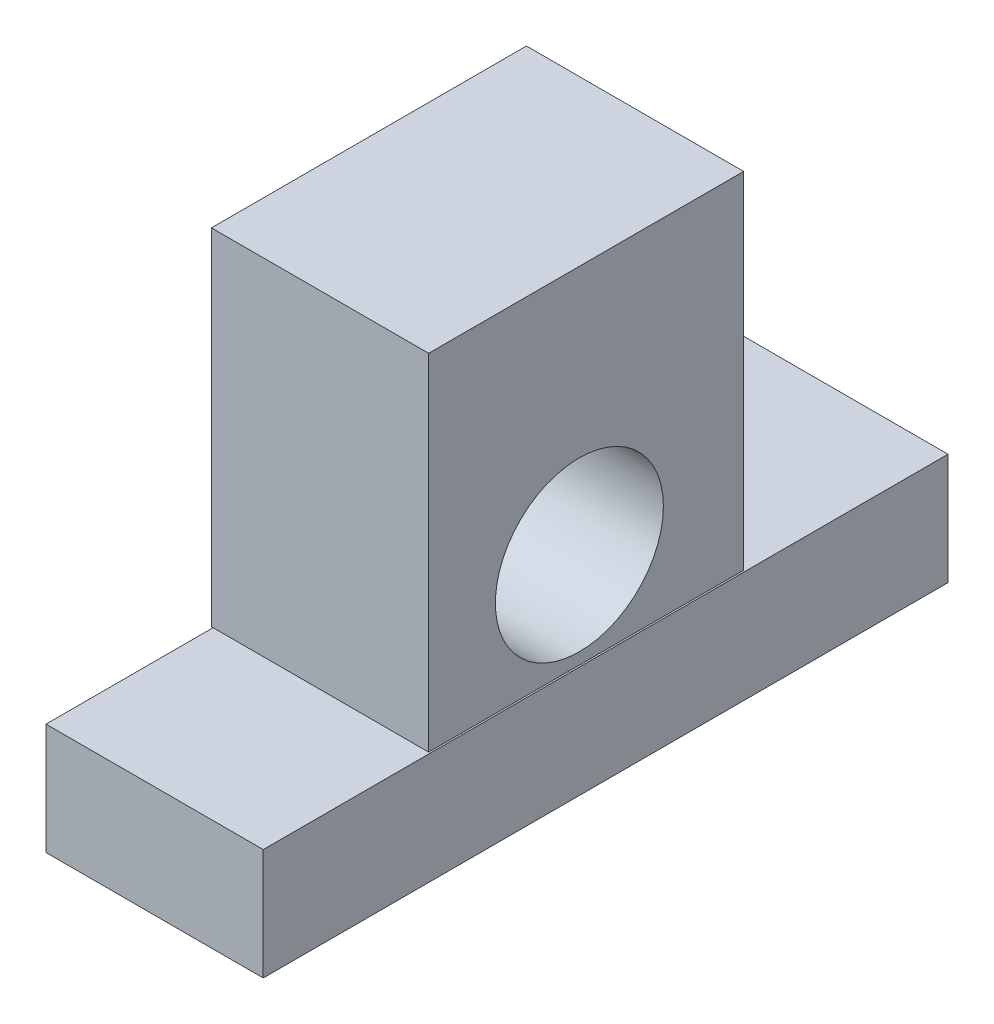
ISO-10303-21;
HEADER;
FILE_DESCRIPTION(('STEP AP214'),'2;1');
FILE_NAME('part.step','',(''),(''),'','','');
FILE_SCHEMA(('AUTOMOTIVE_DESIGN { 1 0 10303 214 1 1 1 1 }'));
ENDSEC;
DATA;
#1=APPLICATION_CONTEXT('core data for automotive mechanical design processes');
#2=APPLICATION_PROTOCOL_DEFINITION('international standard','automotive_design',2000,#1);
#3=PRODUCT_CONTEXT('',#1,'mechanical');
#4=PRODUCT('Part','Part','',(#3));
#5=PRODUCT_RELATED_PRODUCT_CATEGORY('part','',(#4));
#6=PRODUCT_DEFINITION_FORMATION('','',#4);
#7=PRODUCT_DEFINITION_CONTEXT('part definition',#1,'design');
#8=PRODUCT_DEFINITION('design','',#6,#7);
#9=PRODUCT_DEFINITION_SHAPE('','',#8);
#10=(LENGTH_UNIT() NAMED_UNIT(*) SI_UNIT(.MILLI.,.METRE.));
#11=(NAMED_UNIT(*) PLANE_ANGLE_UNIT() SI_UNIT($,.RADIAN.));
#12=(NAMED_UNIT(*) SI_UNIT($,.STERADIAN.) SOLID_ANGLE_UNIT());
#13=UNCERTAINTY_MEASURE_WITH_UNIT(LENGTH_MEASURE(1.E-05),#10,'distance_accuracy_value','');
#14=(GEOMETRIC_REPRESENTATION_CONTEXT(3) GLOBAL_UNCERTAINTY_ASSIGNED_CONTEXT((#13)) GLOBAL_UNIT_ASSIGNED_CONTEXT((#10,
#11,#12)) REPRESENTATION_CONTEXT('',''));
#15=CARTESIAN_POINT('',(0.,0.,0.));
#16=DIRECTION('',(0.,0.,1.));
#17=DIRECTION('',(1.,0.,0.));
#18=AXIS2_PLACEMENT_3D('',#15,#16,#17);
#19=CARTESIAN_POINT('',(31.75,-13.97,22.0275119617225));
#20=DIRECTION('',(0.,1.,0.));
#21=DIRECTION('',(0.,0.,1.));
#22=AXIS2_PLACEMENT_3D('',#19,#20,#21);
#23=PLANE('',#22);
#24=DIRECTION('',(0.,0.,-1.));
#25=VECTOR('',#24,1.);
#26=CARTESIAN_POINT('',(0.242688265662183,-13.97,-53.6300320258065));
#27=LINE('',#26,#25);
#28=CARTESIAN_POINT('',(0.242688265662178,-13.97,22.0275119617225));
#29=VERTEX_POINT('',#28);
#30=CARTESIAN_POINT('',(0.24268826566218,-13.97,-24.0099880382775));
#31=VERTEX_POINT('',#30);
#32=EDGE_CURVE('E11',#29,#31,#27,.T.);
#33=ORIENTED_EDGE('',*,*,#32,.F.);
#34=DIRECTION('',(-1.,0.,0.));
#35=VECTOR('',#34,1.);
#36=CARTESIAN_POINT('',(31.75,-13.97,22.0275119617225));
#37=LINE('',#36,#35);
#38=CARTESIAN_POINT('',(0.,-13.97,22.0275119617225));
#39=VERTEX_POINT('',#38);
#40=EDGE_CURVE('E170',#29,#39,#37,.T.);
#41=ORIENTED_EDGE('',*,*,#40,.T.);
#42=DIRECTION('',(0.,0.,-1.));
#43=VECTOR('',#42,1.);
#44=CARTESIAN_POINT('',(0.,-13.97,22.0275119617225));
#45=LINE('',#44,#43);
#46=CARTESIAN_POINT('',(0.,-13.97,-24.0099880382775));
#47=VERTEX_POINT('',#46);
#48=EDGE_CURVE('E160',#39,#47,#45,.T.);
#49=ORIENTED_EDGE('',*,*,#48,.T.);
#50=DIRECTION('',(-1.,0.,0.));
#51=VECTOR('',#50,1.);
#52=CARTESIAN_POINT('',(31.75,-13.97,-24.0099880382775));
#53=LINE('',#52,#51);
#54=EDGE_CURVE('E168',#31,#47,#53,.T.);
#55=ORIENTED_EDGE('',*,*,#54,.F.);
#56=EDGE_LOOP('',(#33,#41,#49,#55));
#57=FACE_BOUND('',#56,.T.);
#58=ADVANCED_FACE('F33',(#57),#23,.F.);
#59=CARTESIAN_POINT('',(31.75,0.,0.));
#60=DIRECTION('',(1.,0.,0.));
#61=DIRECTION('',(0.,0.,-1.));
#62=AXIS2_PLACEMENT_3D('',#59,#60,#61);
#63=PLANE('',#62);
#64=DIRECTION('',(0.,-1.,0.));
#65=VECTOR('',#64,1.);
#66=CARTESIAN_POINT('',(31.75,36.5125,22.0275119617225));
#67=LINE('',#66,#65);
#68=CARTESIAN_POINT('',(31.75,36.5125,22.0275119617225));
#69=VERTEX_POINT('',#68);
#70=CARTESIAN_POINT('',(31.75,-13.97,22.0275119617225));
#71=VERTEX_POINT('',#70);
#72=EDGE_CURVE('E83',#69,#71,#67,.T.);
#73=ORIENTED_EDGE('',*,*,#72,.T.);
#74=DIRECTION('',(0.,0.,-1.));
#75=VECTOR('',#74,1.);
#76=CARTESIAN_POINT('',(31.75,-13.97,22.0275119617225));
#77=LINE('',#76,#75);
#78=CARTESIAN_POINT('',(31.75,-13.97,-24.0099880382775));
#79=VERTEX_POINT('',#78);
#80=EDGE_CURVE('E152',#71,#79,#77,.T.);
#81=ORIENTED_EDGE('',*,*,#80,.T.);
#82=DIRECTION('',(0.,1.,0.));
#83=VECTOR('',#82,1.);
#84=CARTESIAN_POINT('',(31.75,36.5125,-24.0099880382775));
#85=LINE('',#84,#83);
#86=CARTESIAN_POINT('',(31.75,36.5125,-24.0099880382775));
#87=VERTEX_POINT('',#86);
#88=EDGE_CURVE('E154',#79,#87,#85,.T.);
#89=ORIENTED_EDGE('',*,*,#88,.T.);
#90=DIRECTION('',(0.,0.,1.));
#91=VECTOR('',#90,1.);
#92=CARTESIAN_POINT('',(31.75,36.5125,22.0275119617225));
#93=LINE('',#92,#91);
#94=EDGE_CURVE('E58',#87,#69,#93,.T.);
#95=ORIENTED_EDGE('',*,*,#94,.T.);
#96=EDGE_LOOP('',(#73,#81,#89,#95));
#97=FACE_BOUND('',#96,.T.);
#98=CARTESIAN_POINT('',(31.75,0.,0.));
#99=DIRECTION('',(1.,0.,0.));
#100=DIRECTION('',(0.,0.,-1.));
#101=AXIS2_PLACEMENT_3D('',#98,#99,#100);
#102=CIRCLE('',#101,12.2772807915406);
#103=CARTESIAN_POINT('',(31.75,0.,-12.2772807915406));
#104=VERTEX_POINT('',#103);
#105=EDGE_CURVE('E142',#104,#104,#102,.T.);
#106=ORIENTED_EDGE('',*,*,#105,.F.);
#107=EDGE_LOOP('',(#106));
#108=FACE_BOUND('',#107,.T.);
#109=ADVANCED_FACE('F215',(#97,#108),#63,.T.);
#110=CARTESIAN_POINT('',(0.,0.,0.));
#111=DIRECTION('',(1.,0.,0.));
#112=DIRECTION('',(0.,0.,-1.));
#113=AXIS2_PLACEMENT_3D('',#110,#111,#112);
#114=PLANE('',#113);
#115=DIRECTION('',(0.,-1.,0.));
#116=VECTOR('',#115,1.);
#117=CARTESIAN_POINT('',(0.,36.5125,22.0275119617225));
#118=LINE('',#117,#116);
#119=CARTESIAN_POINT('',(0.,36.5125,22.0275119617225));
#120=VERTEX_POINT('',#119);
#121=EDGE_CURVE('E149',#120,#39,#118,.T.);
#122=ORIENTED_EDGE('',*,*,#121,.F.);
#123=DIRECTION('',(0.,0.,1.));
#124=VECTOR('',#123,1.);
#125=CARTESIAN_POINT('',(0.,36.5125,22.0275119617225));
#126=LINE('',#125,#124);
#127=CARTESIAN_POINT('',(0.,36.5125,-24.0099880382775));
#128=VERTEX_POINT('',#127);
#129=EDGE_CURVE('E78',#128,#120,#126,.T.);
#130=ORIENTED_EDGE('',*,*,#129,.F.);
#131=DIRECTION('',(0.,1.,0.));
#132=VECTOR('',#131,1.);
#133=CARTESIAN_POINT('',(0.,36.5125,-24.0099880382775));
#134=LINE('',#133,#132);
#135=EDGE_CURVE('E163',#47,#128,#134,.T.);
#136=ORIENTED_EDGE('',*,*,#135,.F.);
#137=ORIENTED_EDGE('',*,*,#48,.F.);
#138=EDGE_LOOP('',(#122,#130,#136,#137));
#139=FACE_BOUND('',#138,.T.);
#140=CARTESIAN_POINT('',(0.,0.,0.));
#141=DIRECTION('',(1.,0.,0.));
#142=DIRECTION('',(0.,0.,-1.));
#143=AXIS2_PLACEMENT_3D('',#140,#141,#142);
#144=CIRCLE('',#143,12.2772807915406);
#145=CARTESIAN_POINT('',(0.,0.,-12.2772807915406));
#146=VERTEX_POINT('',#145);
#147=EDGE_CURVE('E139',#146,#146,#144,.T.);
#148=ORIENTED_EDGE('',*,*,#147,.T.);
#149=EDGE_LOOP('',(#148));
#150=FACE_BOUND('',#149,.T.);
#151=ADVANCED_FACE('F180',(#139,#150),#114,.F.);
#152=CARTESIAN_POINT('',(31.75,36.5125,22.0275119617225));
#153=DIRECTION('',(0.,0.,-1.));
#154=DIRECTION('',(0.,1.,0.));
#155=AXIS2_PLACEMENT_3D('',#152,#153,#154);
#156=PLANE('',#155);
#157=ORIENTED_EDGE('',*,*,#121,.T.);
#158=ORIENTED_EDGE('',*,*,#40,.F.);
#159=EDGE_CURVE('E37',#71,#29,#37,.T.);
#160=ORIENTED_EDGE('',*,*,#159,.F.);
#161=ORIENTED_EDGE('',*,*,#72,.F.);
#162=DIRECTION('',(-1.,0.,0.));
#163=VECTOR('',#162,1.);
#164=CARTESIAN_POINT('',(31.75,36.5125,22.0275119617225));
#165=LINE('',#164,#163);
#166=EDGE_CURVE('E157',#69,#120,#165,.T.);
#167=ORIENTED_EDGE('',*,*,#166,.T.);
#168=EDGE_LOOP('',(#157,#158,#160,#161,#167));
#169=FACE_BOUND('',#168,.T.);
#170=ADVANCED_FACE('F35',(#169),#156,.F.);
#171=CARTESIAN_POINT('',(31.75,36.5125,-24.0099880382775));
#172=DIRECTION('',(0.,0.,1.));
#173=DIRECTION('',(0.,-1.,0.));
#174=AXIS2_PLACEMENT_3D('',#171,#172,#173);
#175=PLANE('',#174);
#176=ORIENTED_EDGE('',*,*,#135,.T.);
#177=DIRECTION('',(-1.,0.,0.));
#178=VECTOR('',#177,1.);
#179=CARTESIAN_POINT('',(31.75,36.5125,-24.0099880382775));
#180=LINE('',#179,#178);
#181=EDGE_CURVE('E167',#87,#128,#180,.T.);
#182=ORIENTED_EDGE('',*,*,#181,.F.);
#183=ORIENTED_EDGE('',*,*,#88,.F.);
#184=EDGE_CURVE('E169',#79,#31,#53,.T.);
#185=ORIENTED_EDGE('',*,*,#184,.T.);
#186=ORIENTED_EDGE('',*,*,#54,.T.);
#187=EDGE_LOOP('',(#176,#182,#183,#185,#186));
#188=FACE_BOUND('',#187,.T.);
#189=ADVANCED_FACE('F174',(#188),#175,.F.);
#190=CARTESIAN_POINT('',(31.75,36.5125,22.0275119617225));
#191=DIRECTION('',(0.,-1.,0.));
#192=DIRECTION('',(0.,0.,-1.));
#193=AXIS2_PLACEMENT_3D('',#190,#191,#192);
#194=PLANE('',#193);
#195=ORIENTED_EDGE('',*,*,#129,.T.);
#196=ORIENTED_EDGE('',*,*,#166,.F.);
#197=ORIENTED_EDGE('',*,*,#94,.F.);
#198=ORIENTED_EDGE('',*,*,#181,.T.);
#199=EDGE_LOOP('',(#195,#196,#197,#198));
#200=FACE_BOUND('',#199,.T.);
#201=ADVANCED_FACE('F184',(#200),#194,.F.);
#202=CARTESIAN_POINT('',(31.75,0.,0.));
#203=DIRECTION('',(-1.,0.,0.));
#204=DIRECTION('',(0.,0.,1.));
#205=AXIS2_PLACEMENT_3D('',#202,#203,#204);
#206=CYLINDRICAL_SURFACE('',#205,12.2772807915406);
#207=ORIENTED_EDGE('',*,*,#105,.T.);
#208=EDGE_LOOP('',(#207));
#209=FACE_BOUND('',#208,.T.);
#210=ORIENTED_EDGE('',*,*,#147,.F.);
#211=EDGE_LOOP('',(#210));
#212=FACE_BOUND('',#211,.T.);
#213=ADVANCED_FACE('F225',(#209,#212),#206,.F.);
#214=CARTESIAN_POINT('',(0.,-13.97,0.));
#215=DIRECTION('',(0.,1.,0.));
#216=DIRECTION('',(0.,0.,1.));
#217=AXIS2_PLACEMENT_3D('',#214,#215,#216);
#218=PLANE('',#217);
#219=ORIENTED_EDGE('',*,*,#184,.F.);
#220=ORIENTED_EDGE('',*,*,#80,.F.);
#221=ORIENTED_EDGE('',*,*,#159,.T.);
#222=CARTESIAN_POINT('',(0.242688265662171,-13.97,46.4459679741935));
#223=VERTEX_POINT('',#222);
#224=EDGE_CURVE('E43',#223,#29,#27,.T.);
#225=ORIENTED_EDGE('',*,*,#224,.F.);
#226=DIRECTION('',(-1.,0.,0.));
#227=VECTOR('',#226,1.);
#228=CARTESIAN_POINT('',(0.242688265662171,-13.97,46.4459679741935));
#229=LINE('',#228,#227);
#230=CARTESIAN_POINT('',(31.9926882656622,-13.97,46.4459679741935));
#231=VERTEX_POINT('',#230);
#232=EDGE_CURVE('E133',#231,#223,#229,.T.);
#233=ORIENTED_EDGE('',*,*,#232,.F.);
#234=DIRECTION('',(0.,0.,1.));
#235=VECTOR('',#234,1.);
#236=CARTESIAN_POINT('',(31.9926882656622,-13.97,-53.6300320258065));
#237=LINE('',#236,#235);
#238=CARTESIAN_POINT('',(31.9926882656622,-13.97,-53.6300320258065));
#239=VERTEX_POINT('',#238);
#240=EDGE_CURVE('E193',#239,#231,#237,.T.);
#241=ORIENTED_EDGE('',*,*,#240,.F.);
#242=DIRECTION('',(1.,0.,0.));
#243=VECTOR('',#242,1.);
#244=CARTESIAN_POINT('',(0.242688265662183,-13.97,-53.6300320258065));
#245=LINE('',#244,#243);
#246=CARTESIAN_POINT('',(0.242688265662183,-13.97,-53.6300320258065));
#247=VERTEX_POINT('',#246);
#248=EDGE_CURVE('E189',#247,#239,#245,.T.);
#249=ORIENTED_EDGE('',*,*,#248,.F.);
#250=EDGE_CURVE('E44',#31,#247,#27,.T.);
#251=ORIENTED_EDGE('',*,*,#250,.F.);
#252=EDGE_LOOP('',(#219,#220,#221,#225,#233,#241,#249,#251));
#253=FACE_BOUND('',#252,.T.);
#254=ADVANCED_FACE('F187',(#253),#218,.T.);
#255=CARTESIAN_POINT('',(0.242688265662183,-30.226,-53.6300320258065));
#256=DIRECTION('',(1.,0.,0.));
#257=DIRECTION('',(0.,0.,-1.));
#258=AXIS2_PLACEMENT_3D('',#255,#256,#257);
#259=PLANE('',#258);
#260=ORIENTED_EDGE('',*,*,#224,.T.);
#261=ORIENTED_EDGE('',*,*,#32,.T.);
#262=ORIENTED_EDGE('',*,*,#250,.T.);
#263=DIRECTION('',(0.,1.,0.));
#264=VECTOR('',#263,1.);
#265=CARTESIAN_POINT('',(0.242688265662183,-30.226,-53.6300320258065));
#266=LINE('',#265,#264);
#267=CARTESIAN_POINT('',(0.242688265662183,-30.226,-53.6300320258065));
#268=VERTEX_POINT('',#267);
#269=EDGE_CURVE('E118',#268,#247,#266,.T.);
#270=ORIENTED_EDGE('',*,*,#269,.F.);
#271=DIRECTION('',(0.,0.,-1.));
#272=VECTOR('',#271,1.);
#273=CARTESIAN_POINT('',(0.242688265662183,-30.226,-53.6300320258065));
#274=LINE('',#273,#272);
#275=CARTESIAN_POINT('',(0.242688265662171,-30.226,46.4459679741935));
#276=VERTEX_POINT('',#275);
#277=EDGE_CURVE('E124',#276,#268,#274,.T.);
#278=ORIENTED_EDGE('',*,*,#277,.F.);
#279=DIRECTION('',(0.,1.,0.));
#280=VECTOR('',#279,1.);
#281=CARTESIAN_POINT('',(0.242688265662171,-30.226,46.4459679741935));
#282=LINE('',#281,#280);
#283=EDGE_CURVE('E191',#276,#223,#282,.T.);
#284=ORIENTED_EDGE('',*,*,#283,.T.);
#285=EDGE_LOOP('',(#260,#261,#262,#270,#278,#284));
#286=FACE_BOUND('',#285,.T.);
#287=ADVANCED_FACE('F136',(#286),#259,.F.);
#288=CARTESIAN_POINT('',(0.242688265662183,-30.226,-53.6300320258065));
#289=DIRECTION('',(0.,0.,1.));
#290=DIRECTION('',(1.,0.,0.));
#291=AXIS2_PLACEMENT_3D('',#288,#289,#290);
#292=PLANE('',#291);
#293=ORIENTED_EDGE('',*,*,#248,.T.);
#294=DIRECTION('',(0.,1.,0.));
#295=VECTOR('',#294,1.);
#296=CARTESIAN_POINT('',(31.9926882656622,-30.226,-53.6300320258065));
#297=LINE('',#296,#295);
#298=CARTESIAN_POINT('',(31.9926882656622,-30.226,-53.6300320258065));
#299=VERTEX_POINT('',#298);
#300=EDGE_CURVE('E120',#299,#239,#297,.T.);
#301=ORIENTED_EDGE('',*,*,#300,.F.);
#302=DIRECTION('',(1.,0.,0.));
#303=VECTOR('',#302,1.);
#304=CARTESIAN_POINT('',(0.242688265662183,-30.226,-53.6300320258065));
#305=LINE('',#304,#303);
#306=EDGE_CURVE('E114',#268,#299,#305,.T.);
#307=ORIENTED_EDGE('',*,*,#306,.F.);
#308=ORIENTED_EDGE('',*,*,#269,.T.);
#309=EDGE_LOOP('',(#293,#301,#307,#308));
#310=FACE_BOUND('',#309,.T.);
#311=ADVANCED_FACE('F116',(#310),#292,.F.);
#312=CARTESIAN_POINT('',(31.9926882656622,-30.226,-53.6300320258065));
#313=DIRECTION('',(-1.,0.,0.));
#314=DIRECTION('',(0.,0.,1.));
#315=AXIS2_PLACEMENT_3D('',#312,#313,#314);
#316=PLANE('',#315);
#317=ORIENTED_EDGE('',*,*,#240,.T.);
#318=DIRECTION('',(0.,1.,0.));
#319=VECTOR('',#318,1.);
#320=CARTESIAN_POINT('',(31.9926882656622,-30.226,46.4459679741935));
#321=LINE('',#320,#319);
#322=CARTESIAN_POINT('',(31.9926882656622,-30.226,46.4459679741935));
#323=VERTEX_POINT('',#322);
#324=EDGE_CURVE('E144',#323,#231,#321,.T.);
#325=ORIENTED_EDGE('',*,*,#324,.F.);
#326=DIRECTION('',(0.,0.,1.));
#327=VECTOR('',#326,1.);
#328=CARTESIAN_POINT('',(31.9926882656622,-30.226,-53.6300320258065));
#329=LINE('',#328,#327);
#330=EDGE_CURVE('E123',#299,#323,#329,.T.);
#331=ORIENTED_EDGE('',*,*,#330,.F.);
#332=ORIENTED_EDGE('',*,*,#300,.T.);
#333=EDGE_LOOP('',(#317,#325,#331,#332));
#334=FACE_BOUND('',#333,.T.);
#335=ADVANCED_FACE('F205',(#334),#316,.F.);
#336=CARTESIAN_POINT('',(0.242688265662171,-30.226,46.4459679741935));
#337=DIRECTION('',(0.,0.,-1.));
#338=DIRECTION('',(-1.,0.,0.));
#339=AXIS2_PLACEMENT_3D('',#336,#337,#338);
#340=PLANE('',#339);
#341=ORIENTED_EDGE('',*,*,#232,.T.);
#342=ORIENTED_EDGE('',*,*,#283,.F.);
#343=DIRECTION('',(-1.,0.,0.));
#344=VECTOR('',#343,1.);
#345=CARTESIAN_POINT('',(0.242688265662171,-30.226,46.4459679741935));
#346=LINE('',#345,#344);
#347=EDGE_CURVE('E129',#323,#276,#346,.T.);
#348=ORIENTED_EDGE('',*,*,#347,.F.);
#349=ORIENTED_EDGE('',*,*,#324,.T.);
#350=EDGE_LOOP('',(#341,#342,#348,#349));
#351=FACE_BOUND('',#350,.T.);
#352=ADVANCED_FACE('F203',(#351),#340,.F.);
#353=CARTESIAN_POINT('',(0.,-30.226,0.));
#354=DIRECTION('',(0.,1.,0.));
#355=DIRECTION('',(0.,0.,1.));
#356=AXIS2_PLACEMENT_3D('',#353,#354,#355);
#357=PLANE('',#356);
#358=ORIENTED_EDGE('',*,*,#277,.T.);
#359=ORIENTED_EDGE('',*,*,#306,.T.);
#360=ORIENTED_EDGE('',*,*,#330,.T.);
#361=ORIENTED_EDGE('',*,*,#347,.T.);
#362=EDGE_LOOP('',(#358,#359,#360,#361));
#363=FACE_BOUND('',#362,.T.);
#364=ADVANCED_FACE('F127',(#363),#357,.F.);
#365=CLOSED_SHELL('',(#58,#109,#151,#170,#189,#201,#213,#254,#287,#311,#335,#352,#364));
#366=MANIFOLD_SOLID_BREP('B2',#365);
#367=ADVANCED_BREP_SHAPE_REPRESENTATION('',(#18,#366),#14);
#368=SHAPE_DEFINITION_REPRESENTATION(#9,#367);
ENDSEC;
END-ISO-10303-21;
